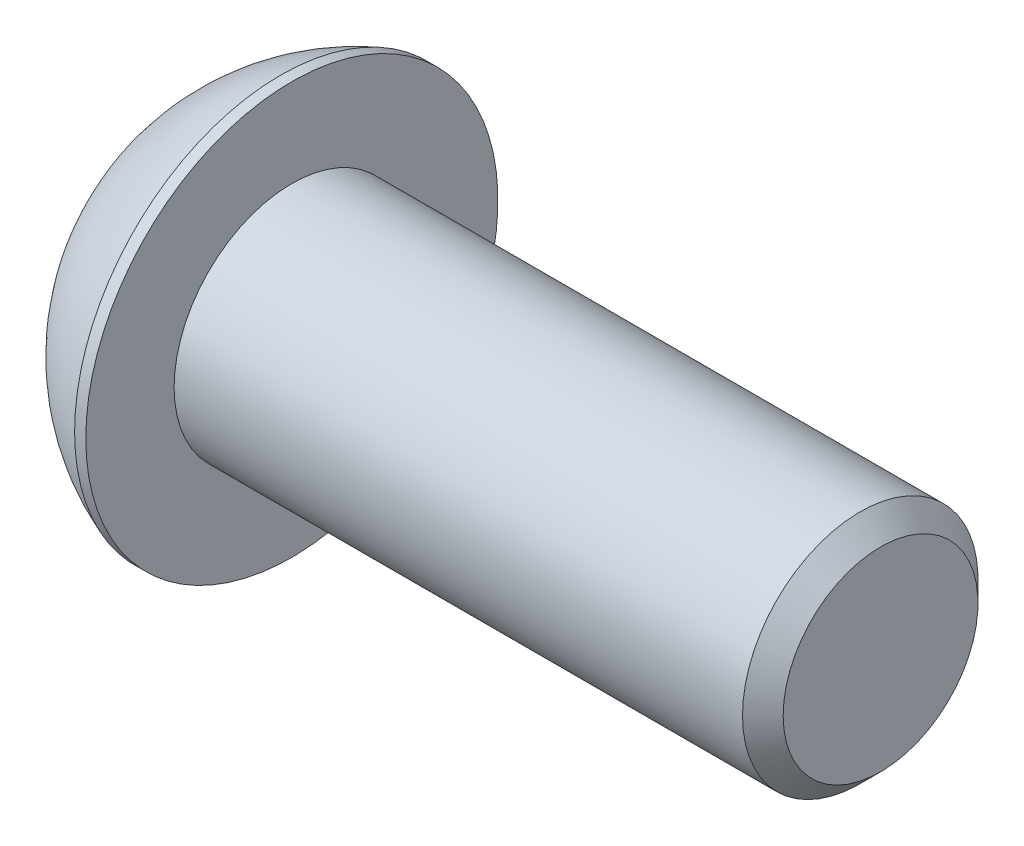
ISO-10303-21;
HEADER;
FILE_DESCRIPTION(('STEP AP214'),'2;1');
FILE_NAME('part.step','',(''),(''),'','','');
FILE_SCHEMA(('AUTOMOTIVE_DESIGN { 1 0 10303 214 1 1 1 1 }'));
ENDSEC;
DATA;
#1=APPLICATION_CONTEXT('core data for automotive mechanical design processes');
#2=APPLICATION_PROTOCOL_DEFINITION('international standard','automotive_design',2000,#1);
#3=PRODUCT_CONTEXT('',#1,'mechanical');
#4=PRODUCT('Part','Part','',(#3));
#5=PRODUCT_RELATED_PRODUCT_CATEGORY('part','',(#4));
#6=PRODUCT_DEFINITION_FORMATION('','',#4);
#7=PRODUCT_DEFINITION_CONTEXT('part definition',#1,'design');
#8=PRODUCT_DEFINITION('design','',#6,#7);
#9=PRODUCT_DEFINITION_SHAPE('','',#8);
#10=(LENGTH_UNIT() NAMED_UNIT(*) SI_UNIT(.MILLI.,.METRE.));
#11=(NAMED_UNIT(*) PLANE_ANGLE_UNIT() SI_UNIT($,.RADIAN.));
#12=(NAMED_UNIT(*) SI_UNIT($,.STERADIAN.) SOLID_ANGLE_UNIT());
#13=UNCERTAINTY_MEASURE_WITH_UNIT(LENGTH_MEASURE(1.E-05),#10,'distance_accuracy_value','');
#14=(GEOMETRIC_REPRESENTATION_CONTEXT(3) GLOBAL_UNCERTAINTY_ASSIGNED_CONTEXT((#13)) GLOBAL_UNIT_ASSIGNED_CONTEXT((#10,
#11,#12)) REPRESENTATION_CONTEXT('',''));
#15=CARTESIAN_POINT('',(0.,0.,0.));
#16=DIRECTION('',(0.,0.,1.));
#17=DIRECTION('',(1.,0.,0.));
#18=AXIS2_PLACEMENT_3D('',#15,#16,#17);
#19=CARTESIAN_POINT('',(-4.4,0.,0.));
#20=DIRECTION('',(-1.,0.,0.));
#21=DIRECTION('',(0.,0.,1.));
#22=AXIS2_PLACEMENT_3D('',#19,#20,#21);
#23=CYLINDRICAL_SURFACE('',#22,4.);
#24=CARTESIAN_POINT('',(0.,0.,0.));
#25=DIRECTION('',(-1.,0.,0.));
#26=DIRECTION('',(0.,0.,1.));
#27=AXIS2_PLACEMENT_3D('',#24,#25,#26);
#28=CIRCLE('',#27,4.);
#29=CARTESIAN_POINT('',(0.,0.,4.));
#30=VERTEX_POINT('',#29);
#31=EDGE_CURVE('E11',#30,#30,#28,.T.);
#32=ORIENTED_EDGE('',*,*,#31,.F.);
#33=EDGE_LOOP('',(#32));
#34=FACE_BOUND('',#33,.T.);
#35=CARTESIAN_POINT('',(19.3095,0.,0.));
#36=DIRECTION('',(-1.,0.,0.));
#37=DIRECTION('',(0.,0.,1.));
#38=AXIS2_PLACEMENT_3D('',#35,#36,#37);
#39=CIRCLE('',#38,4.);
#40=CARTESIAN_POINT('',(19.3095,0.,4.));
#41=VERTEX_POINT('',#40);
#42=EDGE_CURVE('E137',#41,#41,#39,.T.);
#43=ORIENTED_EDGE('',*,*,#42,.T.);
#44=EDGE_LOOP('',(#43));
#45=FACE_BOUND('',#44,.T.);
#46=ADVANCED_FACE('F36',(#34,#45),#23,.T.);
#47=CARTESIAN_POINT('',(0.,0.,-4.));
#48=DIRECTION('',(-1.,0.,0.));
#49=DIRECTION('',(0.,0.,1.));
#50=AXIS2_PLACEMENT_3D('',#47,#48,#49);
#51=PLANE('',#50);
#52=CARTESIAN_POINT('',(0.,0.,0.));
#53=DIRECTION('',(-1.,0.,0.));
#54=DIRECTION('',(0.,0.,1.));
#55=AXIS2_PLACEMENT_3D('',#52,#53,#54);
#56=CIRCLE('',#55,7.);
#57=CARTESIAN_POINT('',(0.,0.,7.));
#58=VERTEX_POINT('',#57);
#59=EDGE_CURVE('E43',#58,#58,#56,.T.);
#60=ORIENTED_EDGE('',*,*,#59,.F.);
#61=EDGE_LOOP('',(#60));
#62=FACE_BOUND('',#61,.T.);
#63=ORIENTED_EDGE('',*,*,#31,.T.);
#64=EDGE_LOOP('',(#63));
#65=FACE_BOUND('',#64,.T.);
#66=ADVANCED_FACE('F158',(#62,#65),#51,.F.);
#67=CARTESIAN_POINT('',(-4.4,0.,0.));
#68=DIRECTION('',(-1.,0.,0.));
#69=DIRECTION('',(0.,0.,1.));
#70=AXIS2_PLACEMENT_3D('',#67,#68,#69);
#71=CYLINDRICAL_SURFACE('',#70,7.);
#72=CARTESIAN_POINT('',(-0.38,0.,0.));
#73=DIRECTION('',(-1.,0.,0.));
#74=DIRECTION('',(0.,0.,1.));
#75=AXIS2_PLACEMENT_3D('',#72,#73,#74);
#76=CIRCLE('',#75,7.);
#77=CARTESIAN_POINT('',(-0.38,0.,-7.));
#78=VERTEX_POINT('',#77);
#79=EDGE_CURVE('E151',#78,#78,#76,.T.);
#80=ORIENTED_EDGE('',*,*,#79,.F.);
#81=EDGE_LOOP('',(#80));
#82=FACE_BOUND('',#81,.T.);
#83=ORIENTED_EDGE('',*,*,#59,.T.);
#84=EDGE_LOOP('',(#83));
#85=FACE_BOUND('',#84,.T.);
#86=ADVANCED_FACE('F156',(#82,#85),#71,.T.);
#87=CARTESIAN_POINT('',(2.18089552238806,0.,0.));
#88=DIRECTION('',(-1.,0.,0.));
#89=DIRECTION('',(0.,0.,-1.));
#90=AXIS2_PLACEMENT_3D('',#87,#88,#89);
#91=SPHERICAL_SURFACE('',#90,7.45373637020972);
#92=CARTESIAN_POINT('',(-4.4,0.,0.));
#93=DIRECTION('',(-1.,0.,0.));
#94=DIRECTION('',(0.,0.,1.));
#95=AXIS2_PLACEMENT_3D('',#92,#93,#94);
#96=CIRCLE('',#95,3.5);
#97=CARTESIAN_POINT('',(-4.4,0.,-3.5));
#98=VERTEX_POINT('',#97);
#99=EDGE_CURVE('E148',#98,#98,#96,.T.);
#100=CARTESIAN_POINT('',(-4.4,0.,-3.5));
#101=CARTESIAN_POINT('',(-4.37333876367701,0.,-3.55013020498047));
#102=CARTESIAN_POINT('',(-4.34610451710624,0.,-3.59995565329748));
#103=CARTESIAN_POINT('',(-4.29050469162401,0.,-3.69897127851891));
#104=CARTESIAN_POINT('',(-4.26213911271255,0.,-3.74816145542334));
#105=CARTESIAN_POINT('',(-4.20429131070385,0.,-3.84588077973399));
#106=CARTESIAN_POINT('',(-4.1748090876066,0.,-3.89440992714021));
#107=CARTESIAN_POINT('',(-4.11474342681735,0.,-3.99078186846221));
#108=CARTESIAN_POINT('',(-4.08415998912534,0.,-4.03862466237799));
#109=CARTESIAN_POINT('',(-4.02190786139365,0.,-4.1335989073342));
#110=CARTESIAN_POINT('',(-3.99023917135396,0.,-4.18073035837464));
#111=CARTESIAN_POINT('',(-3.9258330792777,0.,-4.27425730605322));
#112=CARTESIAN_POINT('',(-3.89309567724112,0.,-4.32065280269138));
#113=CARTESIAN_POINT('',(-3.82656925657667,0.,-4.41268361265678));
#114=CARTESIAN_POINT('',(-3.79278023794881,0.,-4.45831892598402));
#115=CARTESIAN_POINT('',(-3.72416822949616,0.,-4.54880553785828));
#116=CARTESIAN_POINT('',(-3.68934523967138,0.,-4.59365683640532));
#117=CARTESIAN_POINT('',(-3.61868347395864,0.,-4.68255199655347));
#118=CARTESIAN_POINT('',(-3.58284469807068,0.,-4.72659585815459));
#119=CARTESIAN_POINT('',(-3.51017007588531,0.,-4.81385314393593));
#120=CARTESIAN_POINT('',(-3.4733342295879,0.,-4.85706656811615));
#121=CARTESIAN_POINT('',(-3.39868470290943,0.,-4.94264041224098));
#122=CARTESIAN_POINT('',(-3.36087102252837,0.,-4.98500083218559));
#123=CARTESIAN_POINT('',(-3.28428557465483,0.,-5.0688465464807));
#124=CARTESIAN_POINT('',(-3.24551380716235,0.,-5.1103318408312));
#125=CARTESIAN_POINT('',(-3.16703243236705,0.,-5.19240563958501));
#126=CARTESIAN_POINT('',(-3.12732282506424,0.,-5.23299414398831));
#127=CARTESIAN_POINT('',(-3.04698650770619,0.,-5.31325316681434));
#128=CARTESIAN_POINT('',(-3.00635979765096,0.,-5.35292368523707));
#129=CARTESIAN_POINT('',(-2.92421049077313,0.,-5.431326019457));
#130=CARTESIAN_POINT('',(-2.88268789395053,0.,-5.4700578352542));
#131=CARTESIAN_POINT('',(-2.79876849737096,0.,-5.54656253778524));
#132=CARTESIAN_POINT('',(-2.75637169761398,0.,-5.58433542451906));
#133=CARTESIAN_POINT('',(-2.67072603552279,0.,-5.65890254325517));
#134=CARTESIAN_POINT('',(-2.62747717318859,0.,-5.69569677525744));
#135=CARTESIAN_POINT('',(-2.54014997126226,0.,-5.76828736993305));
#136=CARTESIAN_POINT('',(-2.49607163167012,0.,-5.80408373260639));
#137=CARTESIAN_POINT('',(-2.40710849371487,0.,-5.87465989513168));
#138=CARTESIAN_POINT('',(-2.36222369535175,0.,-5.90943969498364));
#139=CARTESIAN_POINT('',(-2.27167107948849,0.,-5.97796456924083));
#140=CARTESIAN_POINT('',(-2.22600326198836,0.,-6.01170964364606));
#141=CARTESIAN_POINT('',(-2.13390845639141,0.,-6.07814744473625));
#142=CARTESIAN_POINT('',(-2.08748146829459,0.,-6.11084017142121));
#143=CARTESIAN_POINT('',(-1.99389256649704,0.,-6.17515620435217));
#144=CARTESIAN_POINT('',(-1.94673065279631,0.,-6.20677951059818));
#145=CARTESIAN_POINT('',(-1.85169652857433,0.,-6.2689401884016));
#146=CARTESIAN_POINT('',(-1.80382431805308,0.,-6.29947755995902));
#147=CARTESIAN_POINT('',(-1.70739459990477,0.,-6.35945042123436));
#148=CARTESIAN_POINT('',(-1.65883709227771,0.,-6.38888591095228));
#149=CARTESIAN_POINT('',(-1.56106213750016,0.,-6.44663963680314));
#150=CARTESIAN_POINT('',(-1.51184469034967,0.,-6.47495787293607));
#151=CARTESIAN_POINT('',(-1.41277555876423,0.,-6.53046230338352));
#152=CARTESIAN_POINT('',(-1.36292387432927,0.,-6.55764849769805));
#153=CARTESIAN_POINT('',(-1.26261230153225,0.,-6.61087464721403));
#154=CARTESIAN_POINT('',(-1.21215241317019,0.,-6.63691460241549));
#155=CARTESIAN_POINT('',(-1.11065078383267,0.,-6.6878346758683));
#156=CARTESIAN_POINT('',(-1.05960904285722,0.,-6.71271479411965));
#157=CARTESIAN_POINT('',(-0.956970362185713,0.,-6.7613021982707));
#158=CARTESIAN_POINT('',(-0.905373422489658,0.,-6.7850094841704));
#159=CARTESIAN_POINT('',(-0.801651292961339,0.,-6.83123885282639));
#160=CARTESIAN_POINT('',(-0.749526103129075,0.,-6.85376093558268));
#161=CARTESIAN_POINT('',(-0.644774680020755,0.,-6.89760810080177));
#162=CARTESIAN_POINT('',(-0.5921484467447,0.,-6.91893318326458));
#163=CARTESIAN_POINT('',(-0.486422471351996,0.,-6.96037534487455));
#164=CARTESIAN_POINT('',(-0.433322729235347,0.,-6.98049242402172));
#165=CARTESIAN_POINT('',(-0.38,0.,-7.));
#166=B_SPLINE_CURVE_WITH_KNOTS('',3,(#100,#101,#102,#103,#104,#105,#106,#107,#108,#109,#110,
#111,#112,#113,#114,#115,#116,#117,#118,#119,#120,#121,#122,#123,#124,#125,#126,#127,#128,#129,
#130,#131,#132,#133,#134,#135,#136,#137,#138,#139,#140,#141,#142,#143,#144,#145,#146,#147,#148,
#149,#150,#151,#152,#153,#154,#155,#156,#157,#158,#159,#160,#161,#162,#163,#164,#165),
.UNSPECIFIED.,.F.,.F.,(4,2,2,2,2,2,2,2,2,2,2,2,2,2,2,2,2,2,2,2,2,2,2,2,2,2,2,2,2,2,2,2,4),(0.,
0.170333394580242,0.340666789160486,0.511000183740729,0.681333578320972,0.851666972901216,
1.02200036748146,1.1923337620617,1.36266715664194,1.53300055122219,1.70333394580243,
1.87366734038267,2.04400073496292,2.21433412954316,2.3846675241234,2.55500091870365,
2.72533431328389,2.89566770786413,3.06600110244437,3.23633449702462,3.40666789160486,
3.5770012861851,3.74733468076535,3.91766807534559,4.08800146992583,4.25833486450608,
4.42866825908632,4.59900165366656,4.76933504824681,4.93966844282705,5.11000183740729,
5.28033523198753,5.45066862656778),.UNSPECIFIED.);
#167=EDGE_CURVE('BSEAM181',#98,#78,#166,.T.);
#168=ORIENTED_EDGE('',*,*,#99,.F.);
#169=ORIENTED_EDGE('',*,*,#79,.T.);
#170=ORIENTED_EDGE('',*,*,#167,.T.);
#171=ORIENTED_EDGE('',*,*,#167,.F.);
#172=EDGE_LOOP('',(#168,#170,#169,#171));
#173=FACE_BOUND('',#172,.T.);
#174=ADVANCED_FACE('F181',(#173),#91,.T.);
#175=CARTESIAN_POINT('',(-4.4,0.,-3.5));
#176=DIRECTION('',(1.,0.,0.));
#177=DIRECTION('',(0.,0.,-1.));
#178=AXIS2_PLACEMENT_3D('',#175,#176,#177);
#179=PLANE('',#178);
#180=DIRECTION('',(0.,0.866025403784439,-0.5));
#181=VECTOR('',#180,1.);
#182=CARTESIAN_POINT('',(-4.4,0.,2.88675134594813));
#183=LINE('',#182,#181);
#184=CARTESIAN_POINT('',(-4.4,0.,2.88675134594813));
#185=VERTEX_POINT('',#184);
#186=CARTESIAN_POINT('',(-4.4,2.5,1.44337567297406));
#187=VERTEX_POINT('',#186);
#188=EDGE_CURVE('E124',#185,#187,#183,.T.);
#189=ORIENTED_EDGE('',*,*,#188,.F.);
#190=DIRECTION('',(0.,0.866025403784439,0.499999999999999));
#191=VECTOR('',#190,1.);
#192=CARTESIAN_POINT('',(-4.4,-2.5,1.44337567297407));
#193=LINE('',#192,#191);
#194=CARTESIAN_POINT('',(-4.4,-2.5,1.44337567297407));
#195=VERTEX_POINT('',#194);
#196=EDGE_CURVE('E50',#195,#185,#193,.T.);
#197=ORIENTED_EDGE('',*,*,#196,.F.);
#198=DIRECTION('',(0.,0.,1.));
#199=VECTOR('',#198,1.);
#200=CARTESIAN_POINT('',(-4.4,-2.5,-1.44337567297406));
#201=LINE('',#200,#199);
#202=CARTESIAN_POINT('',(-4.4,-2.5,-1.44337567297406));
#203=VERTEX_POINT('',#202);
#204=EDGE_CURVE('E133',#203,#195,#201,.T.);
#205=ORIENTED_EDGE('',*,*,#204,.F.);
#206=DIRECTION('',(0.,-0.866025403784439,0.5));
#207=VECTOR('',#206,1.);
#208=CARTESIAN_POINT('',(-4.4,0.,-2.88675134594813));
#209=LINE('',#208,#207);
#210=CARTESIAN_POINT('',(-4.4,0.,-2.88675134594813));
#211=VERTEX_POINT('',#210);
#212=EDGE_CURVE('E131',#211,#203,#209,.T.);
#213=ORIENTED_EDGE('',*,*,#212,.F.);
#214=DIRECTION('',(0.,-0.866025403784439,-0.499999999999999));
#215=VECTOR('',#214,1.);
#216=CARTESIAN_POINT('',(-4.4,2.5,-1.44337567297407));
#217=LINE('',#216,#215);
#218=CARTESIAN_POINT('',(-4.4,2.5,-1.44337567297407));
#219=VERTEX_POINT('',#218);
#220=EDGE_CURVE('E98',#219,#211,#217,.T.);
#221=ORIENTED_EDGE('',*,*,#220,.F.);
#222=DIRECTION('',(0.,0.,-1.));
#223=VECTOR('',#222,1.);
#224=CARTESIAN_POINT('',(-4.4,2.5,1.44337567297406));
#225=LINE('',#224,#223);
#226=EDGE_CURVE('E127',#187,#219,#225,.T.);
#227=ORIENTED_EDGE('',*,*,#226,.F.);
#228=EDGE_LOOP('',(#189,#197,#205,#213,#221,#227));
#229=FACE_BOUND('',#228,.T.);
#230=ORIENTED_EDGE('',*,*,#99,.T.);
#231=EDGE_LOOP('',(#230));
#232=FACE_BOUND('',#231,.T.);
#233=ADVANCED_FACE('F176',(#229,#232),#179,.F.);
#234=CARTESIAN_POINT('',(20.,0.,-3.3095));
#235=DIRECTION('',(-1.,0.,0.));
#236=DIRECTION('',(0.,0.,1.));
#237=AXIS2_PLACEMENT_3D('',#234,#235,#236);
#238=PLANE('',#237);
#239=CARTESIAN_POINT('',(20.,0.,0.));
#240=DIRECTION('',(-1.,0.,0.));
#241=DIRECTION('',(0.,0.,1.));
#242=AXIS2_PLACEMENT_3D('',#239,#240,#241);
#243=CIRCLE('',#242,3.3095);
#244=CARTESIAN_POINT('',(20.,0.,3.3095));
#245=VERTEX_POINT('',#244);
#246=EDGE_CURVE('E145',#245,#245,#243,.T.);
#247=ORIENTED_EDGE('',*,*,#246,.F.);
#248=EDGE_LOOP('',(#247));
#249=FACE_BOUND('',#248,.T.);
#250=ADVANCED_FACE('F171',(#249),#238,.F.);
#251=CARTESIAN_POINT('',(20.,0.,0.));
#252=DIRECTION('',(-1.,0.,0.));
#253=DIRECTION('',(0.,0.,1.));
#254=AXIS2_PLACEMENT_3D('',#251,#252,#253);
#255=CONICAL_SURFACE('',#254,3.3095,0.785398163397443);
#256=ORIENTED_EDGE('',*,*,#42,.F.);
#257=EDGE_LOOP('',(#256));
#258=FACE_BOUND('',#257,.T.);
#259=ORIENTED_EDGE('',*,*,#246,.T.);
#260=EDGE_LOOP('',(#259));
#261=FACE_BOUND('',#260,.T.);
#262=ADVANCED_FACE('F167',(#258,#261),#255,.T.);
#263=CARTESIAN_POINT('',(-1.8,-2.5,1.44337567297407));
#264=DIRECTION('',(0.,-0.499999999999999,0.866025403784439));
#265=DIRECTION('',(0.,-0.866025403784439,-0.499999999999999));
#266=AXIS2_PLACEMENT_3D('',#263,#264,#265);
#267=PLANE('',#266);
#268=ORIENTED_EDGE('',*,*,#196,.T.);
#269=DIRECTION('',(-1.,0.,0.));
#270=VECTOR('',#269,1.);
#271=CARTESIAN_POINT('',(-1.8,0.,2.88675134594813));
#272=LINE('',#271,#270);
#273=CARTESIAN_POINT('',(-1.8,0.,2.88675134594813));
#274=VERTEX_POINT('',#273);
#275=EDGE_CURVE('E80',#274,#185,#272,.T.);
#276=ORIENTED_EDGE('',*,*,#275,.F.);
#277=DIRECTION('',(0.,0.866025403784439,0.499999999999999));
#278=VECTOR('',#277,1.);
#279=CARTESIAN_POINT('',(-1.8,-2.5,1.44337567297407));
#280=LINE('',#279,#278);
#281=CARTESIAN_POINT('',(-1.8,-2.5,1.44337567297407));
#282=VERTEX_POINT('',#281);
#283=EDGE_CURVE('E135',#282,#274,#280,.T.);
#284=ORIENTED_EDGE('',*,*,#283,.F.);
#285=DIRECTION('',(-1.,0.,0.));
#286=VECTOR('',#285,1.);
#287=CARTESIAN_POINT('',(-1.8,-2.5,1.44337567297407));
#288=LINE('',#287,#286);
#289=EDGE_CURVE('E58',#282,#195,#288,.T.);
#290=ORIENTED_EDGE('',*,*,#289,.T.);
#291=EDGE_LOOP('',(#268,#276,#284,#290));
#292=FACE_BOUND('',#291,.T.);
#293=ADVANCED_FACE('F170',(#292),#267,.F.);
#294=CARTESIAN_POINT('',(-1.8,-2.5,-1.44337567297406));
#295=DIRECTION('',(0.,-1.,0.));
#296=DIRECTION('',(0.,0.,-1.));
#297=AXIS2_PLACEMENT_3D('',#294,#295,#296);
#298=PLANE('',#297);
#299=ORIENTED_EDGE('',*,*,#204,.T.);
#300=ORIENTED_EDGE('',*,*,#289,.F.);
#301=DIRECTION('',(0.,0.,1.));
#302=VECTOR('',#301,1.);
#303=CARTESIAN_POINT('',(-1.8,-2.5,-1.44337567297406));
#304=LINE('',#303,#302);
#305=CARTESIAN_POINT('',(-1.8,-2.5,-1.44337567297406));
#306=VERTEX_POINT('',#305);
#307=EDGE_CURVE('E110',#306,#282,#304,.T.);
#308=ORIENTED_EDGE('',*,*,#307,.F.);
#309=DIRECTION('',(-1.,0.,0.));
#310=VECTOR('',#309,1.);
#311=CARTESIAN_POINT('',(-1.8,-2.5,-1.44337567297406));
#312=LINE('',#311,#310);
#313=EDGE_CURVE('E102',#306,#203,#312,.T.);
#314=ORIENTED_EDGE('',*,*,#313,.T.);
#315=EDGE_LOOP('',(#299,#300,#308,#314));
#316=FACE_BOUND('',#315,.T.);
#317=ADVANCED_FACE('F218',(#316),#298,.F.);
#318=CARTESIAN_POINT('',(-1.8,0.,-2.88675134594813));
#319=DIRECTION('',(0.,-0.5,-0.866025403784438));
#320=DIRECTION('',(0.,0.866025403784439,-0.5));
#321=AXIS2_PLACEMENT_3D('',#318,#319,#320);
#322=PLANE('',#321);
#323=ORIENTED_EDGE('',*,*,#212,.T.);
#324=ORIENTED_EDGE('',*,*,#313,.F.);
#325=DIRECTION('',(0.,-0.866025403784439,0.5));
#326=VECTOR('',#325,1.);
#327=CARTESIAN_POINT('',(-1.8,0.,-2.88675134594813));
#328=LINE('',#327,#326);
#329=CARTESIAN_POINT('',(-1.8,0.,-2.88675134594813));
#330=VERTEX_POINT('',#329);
#331=EDGE_CURVE('E106',#330,#306,#328,.T.);
#332=ORIENTED_EDGE('',*,*,#331,.F.);
#333=DIRECTION('',(-1.,0.,0.));
#334=VECTOR('',#333,1.);
#335=CARTESIAN_POINT('',(-1.8,0.,-2.88675134594813));
#336=LINE('',#335,#334);
#337=EDGE_CURVE('E91',#330,#211,#336,.T.);
#338=ORIENTED_EDGE('',*,*,#337,.T.);
#339=EDGE_LOOP('',(#323,#324,#332,#338));
#340=FACE_BOUND('',#339,.T.);
#341=ADVANCED_FACE('F107',(#340),#322,.F.);
#342=CARTESIAN_POINT('',(-1.8,2.5,-1.44337567297407));
#343=DIRECTION('',(0.,0.499999999999999,-0.866025403784439));
#344=DIRECTION('',(0.,0.866025403784439,0.499999999999999));
#345=AXIS2_PLACEMENT_3D('',#342,#343,#344);
#346=PLANE('',#345);
#347=ORIENTED_EDGE('',*,*,#220,.T.);
#348=ORIENTED_EDGE('',*,*,#337,.F.);
#349=DIRECTION('',(0.,-0.866025403784439,-0.499999999999999));
#350=VECTOR('',#349,1.);
#351=CARTESIAN_POINT('',(-1.8,2.5,-1.44337567297407));
#352=LINE('',#351,#350);
#353=CARTESIAN_POINT('',(-1.8,2.5,-1.44337567297407));
#354=VERTEX_POINT('',#353);
#355=EDGE_CURVE('E95',#354,#330,#352,.T.);
#356=ORIENTED_EDGE('',*,*,#355,.F.);
#357=DIRECTION('',(-1.,0.,0.));
#358=VECTOR('',#357,1.);
#359=CARTESIAN_POINT('',(-1.8,2.5,-1.44337567297407));
#360=LINE('',#359,#358);
#361=EDGE_CURVE('E103',#354,#219,#360,.T.);
#362=ORIENTED_EDGE('',*,*,#361,.T.);
#363=EDGE_LOOP('',(#347,#348,#356,#362));
#364=FACE_BOUND('',#363,.T.);
#365=ADVANCED_FACE('F93',(#364),#346,.F.);
#366=CARTESIAN_POINT('',(-1.8,2.5,1.44337567297406));
#367=DIRECTION('',(0.,1.,0.));
#368=DIRECTION('',(0.,0.,1.));
#369=AXIS2_PLACEMENT_3D('',#366,#367,#368);
#370=PLANE('',#369);
#371=ORIENTED_EDGE('',*,*,#226,.T.);
#372=ORIENTED_EDGE('',*,*,#361,.F.);
#373=DIRECTION('',(0.,0.,-1.));
#374=VECTOR('',#373,1.);
#375=CARTESIAN_POINT('',(-1.8,2.5,1.44337567297406));
#376=LINE('',#375,#374);
#377=CARTESIAN_POINT('',(-1.8,2.5,1.44337567297406));
#378=VERTEX_POINT('',#377);
#379=EDGE_CURVE('E116',#378,#354,#376,.T.);
#380=ORIENTED_EDGE('',*,*,#379,.F.);
#381=DIRECTION('',(-1.,0.,0.));
#382=VECTOR('',#381,1.);
#383=CARTESIAN_POINT('',(-1.8,2.5,1.44337567297406));
#384=LINE('',#383,#382);
#385=EDGE_CURVE('E140',#378,#187,#384,.T.);
#386=ORIENTED_EDGE('',*,*,#385,.T.);
#387=EDGE_LOOP('',(#371,#372,#380,#386));
#388=FACE_BOUND('',#387,.T.);
#389=ADVANCED_FACE('F242',(#388),#370,.F.);
#390=CARTESIAN_POINT('',(-1.8,0.,2.88675134594813));
#391=DIRECTION('',(0.,0.5,0.866025403784439));
#392=DIRECTION('',(0.,-0.866025403784439,0.5));
#393=AXIS2_PLACEMENT_3D('',#390,#391,#392);
#394=PLANE('',#393);
#395=ORIENTED_EDGE('',*,*,#188,.T.);
#396=ORIENTED_EDGE('',*,*,#385,.F.);
#397=DIRECTION('',(0.,0.866025403784439,-0.5));
#398=VECTOR('',#397,1.);
#399=CARTESIAN_POINT('',(-1.8,0.,2.88675134594813));
#400=LINE('',#399,#398);
#401=EDGE_CURVE('E118',#274,#378,#400,.T.);
#402=ORIENTED_EDGE('',*,*,#401,.F.);
#403=ORIENTED_EDGE('',*,*,#275,.T.);
#404=EDGE_LOOP('',(#395,#396,#402,#403));
#405=FACE_BOUND('',#404,.T.);
#406=ADVANCED_FACE('F251',(#405),#394,.F.);
#407=CARTESIAN_POINT('',(-1.8,0.,2.88675134594813));
#408=DIRECTION('',(-1.,0.,0.));
#409=DIRECTION('',(0.,0.,1.));
#410=AXIS2_PLACEMENT_3D('',#407,#408,#409);
#411=PLANE('',#410);
#412=ORIENTED_EDGE('',*,*,#283,.T.);
#413=ORIENTED_EDGE('',*,*,#401,.T.);
#414=ORIENTED_EDGE('',*,*,#379,.T.);
#415=ORIENTED_EDGE('',*,*,#355,.T.);
#416=ORIENTED_EDGE('',*,*,#331,.T.);
#417=ORIENTED_EDGE('',*,*,#307,.T.);
#418=EDGE_LOOP('',(#412,#413,#414,#415,#416,#417));
#419=FACE_BOUND('',#418,.T.);
#420=ADVANCED_FACE('F113',(#419),#411,.T.);
#421=CLOSED_SHELL('',(#46,#66,#86,#174,#233,#250,#262,#293,#317,#341,#365,#389,#406,#420));
#422=MANIFOLD_SOLID_BREP('B2',#421);
#423=ADVANCED_BREP_SHAPE_REPRESENTATION('',(#18,#422),#14);
#424=SHAPE_DEFINITION_REPRESENTATION(#9,#423);
ENDSEC;
END-ISO-10303-21;
